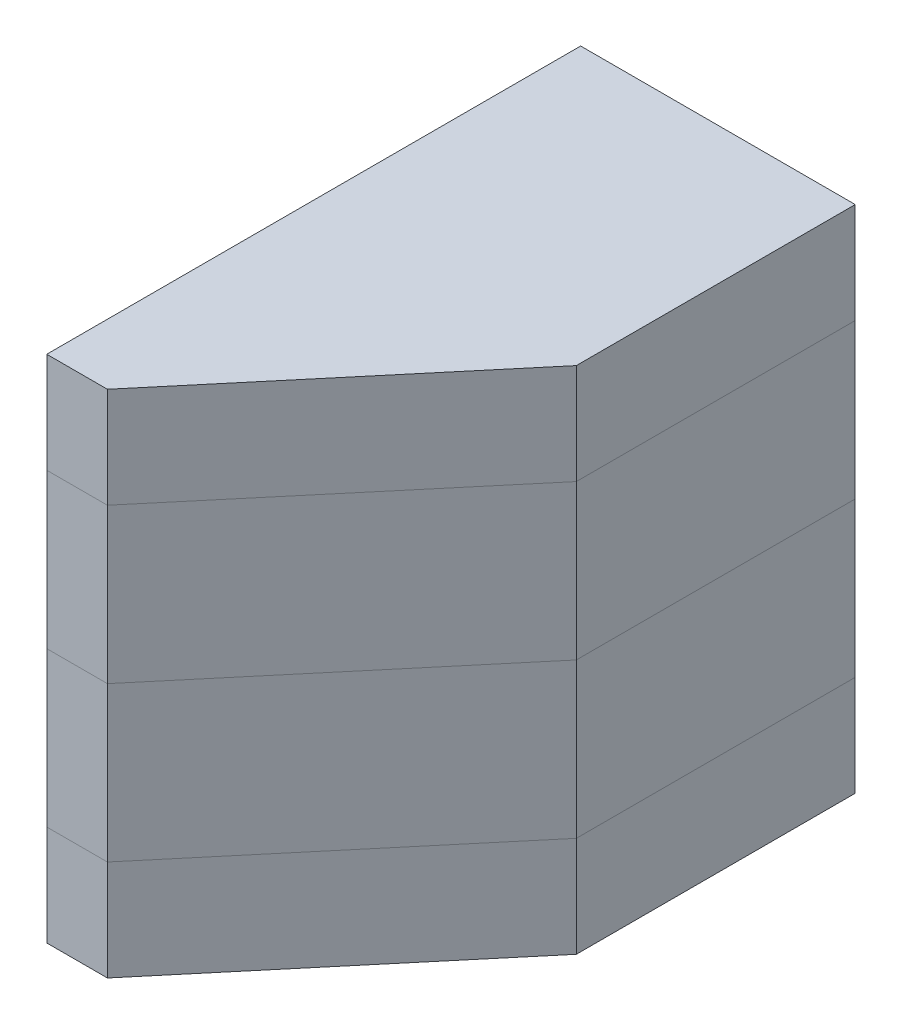
ISO-10303-21;
HEADER;
FILE_DESCRIPTION(('STEP AP214'),'2;1');
FILE_NAME('part.step','',(''),(''),'','','');
FILE_SCHEMA(('AUTOMOTIVE_DESIGN { 1 0 10303 214 1 1 1 1 }'));
ENDSEC;
DATA;
#1=APPLICATION_CONTEXT('core data for automotive mechanical design processes');
#2=APPLICATION_PROTOCOL_DEFINITION('international standard','automotive_design',2000,#1);
#3=PRODUCT_CONTEXT('',#1,'mechanical');
#4=PRODUCT('Part','Part','',(#3));
#5=PRODUCT_RELATED_PRODUCT_CATEGORY('part','',(#4));
#6=PRODUCT_DEFINITION_FORMATION('','',#4);
#7=PRODUCT_DEFINITION_CONTEXT('part definition',#1,'design');
#8=PRODUCT_DEFINITION('design','',#6,#7);
#9=PRODUCT_DEFINITION_SHAPE('','',#8);
#10=(LENGTH_UNIT() NAMED_UNIT(*) SI_UNIT(.MILLI.,.METRE.));
#11=(NAMED_UNIT(*) PLANE_ANGLE_UNIT() SI_UNIT($,.RADIAN.));
#12=(NAMED_UNIT(*) SI_UNIT($,.STERADIAN.) SOLID_ANGLE_UNIT());
#13=UNCERTAINTY_MEASURE_WITH_UNIT(LENGTH_MEASURE(1.E-05),#10,'distance_accuracy_value','');
#14=(GEOMETRIC_REPRESENTATION_CONTEXT(3) GLOBAL_UNCERTAINTY_ASSIGNED_CONTEXT((#13)) GLOBAL_UNIT_ASSIGNED_CONTEXT((#10,
#11,#12)) REPRESENTATION_CONTEXT('',''));
#15=CARTESIAN_POINT('',(0.,0.,0.));
#16=DIRECTION('',(0.,0.,1.));
#17=DIRECTION('',(1.,0.,0.));
#18=AXIS2_PLACEMENT_3D('',#15,#16,#17);
#19=CARTESIAN_POINT('',(0.,0.,0.));
#20=DIRECTION('',(0.,1.,0.));
#21=DIRECTION('',(0.,0.,-1.));
#22=AXIS2_PLACEMENT_3D('',#19,#20,#21);
#23=PLANE('',#22);
#24=DIRECTION('',(0.,0.,1.));
#25=VECTOR('',#24,1.);
#26=CARTESIAN_POINT('',(-25.,0.,50.8));
#27=LINE('',#26,#25);
#28=CARTESIAN_POINT('',(-25.,0.,-0.566132075471792));
#29=VERTEX_POINT('',#28);
#30=CARTESIAN_POINT('',(-25.,0.,50.8));
#31=VERTEX_POINT('',#30);
#32=EDGE_CURVE('E55',#29,#31,#27,.T.);
#33=ORIENTED_EDGE('',*,*,#32,.F.);
#34=DIRECTION('',(-0.952215316531976,0.,0.30542755435931));
#35=VECTOR('',#34,1.);
#36=CARTESIAN_POINT('',(0.,0.,-8.58500000000001));
#37=LINE('',#36,#35);
#38=CARTESIAN_POINT('',(0.,0.,-8.58500000000001));
#39=VERTEX_POINT('',#38);
#40=EDGE_CURVE('E153',#29,#39,#37,.F.);
#41=ORIENTED_EDGE('',*,*,#40,.T.);
#42=DIRECTION('',(0.,0.,1.));
#43=VECTOR('',#42,1.);
#44=CARTESIAN_POINT('',(0.,0.,0.));
#45=LINE('',#44,#43);
#46=CARTESIAN_POINT('',(0.,0.,-22.5));
#47=VERTEX_POINT('',#46);
#48=EDGE_CURVE('E12',#47,#39,#45,.T.);
#49=ORIENTED_EDGE('',*,*,#48,.F.);
#50=DIRECTION('',(1.,0.,0.));
#51=VECTOR('',#50,1.);
#52=CARTESIAN_POINT('',(0.,0.,-22.5));
#53=LINE('',#52,#51);
#54=CARTESIAN_POINT('',(12.7,0.,-22.5));
#55=VERTEX_POINT('',#54);
#56=EDGE_CURVE('E147',#47,#55,#53,.T.);
#57=ORIENTED_EDGE('',*,*,#56,.T.);
#58=DIRECTION('',(0.,0.,1.));
#59=VECTOR('',#58,1.);
#60=CARTESIAN_POINT('',(12.7,0.,50.8));
#61=LINE('',#60,#59);
#62=CARTESIAN_POINT('',(12.7,0.,15.7951145763081));
#63=VERTEX_POINT('',#62);
#64=EDGE_CURVE('E120',#55,#63,#61,.T.);
#65=ORIENTED_EDGE('',*,*,#64,.T.);
#66=DIRECTION('',(-0.642787609686535,0.,0.766044443118982));
#67=VECTOR('',#66,1.);
#68=CARTESIAN_POINT('',(12.7,0.,15.7951145763081));
#69=LINE('',#68,#67);
#70=CARTESIAN_POINT('',(-16.6725864484225,0.,50.8));
#71=VERTEX_POINT('',#70);
#72=EDGE_CURVE('E148',#63,#71,#69,.T.);
#73=ORIENTED_EDGE('',*,*,#72,.T.);
#74=DIRECTION('',(-1.,0.,0.));
#75=VECTOR('',#74,1.);
#76=CARTESIAN_POINT('',(-25.,0.,50.8));
#77=LINE('',#76,#75);
#78=EDGE_CURVE('E152',#71,#31,#77,.T.);
#79=ORIENTED_EDGE('',*,*,#78,.T.);
#80=EDGE_LOOP('',(#33,#41,#49,#57,#65,#73,#79));
#81=FACE_BOUND('',#80,.T.);
#82=ADVANCED_FACE('F52',(#81),#23,.F.);
#83=CARTESIAN_POINT('',(-25.,35.,50.8));
#84=DIRECTION('',(0.,0.,-1.));
#85=DIRECTION('',(-1.,0.,0.));
#86=AXIS2_PLACEMENT_3D('',#83,#84,#85);
#87=PLANE('',#86);
#88=DIRECTION('',(0.,1.,0.));
#89=VECTOR('',#88,1.);
#90=CARTESIAN_POINT('',(-16.6725864484225,-35.,50.8));
#91=LINE('',#90,#89);
#92=CARTESIAN_POINT('',(-16.6725864484225,21.21,50.8));
#93=VERTEX_POINT('',#92);
#94=EDGE_CURVE('E170',#71,#93,#91,.T.);
#95=ORIENTED_EDGE('',*,*,#94,.T.);
#96=DIRECTION('',(1.,0.,0.));
#97=VECTOR('',#96,1.);
#98=CARTESIAN_POINT('',(-25.,21.21,50.8));
#99=LINE('',#98,#97);
#100=CARTESIAN_POINT('',(-25.,21.21,50.8));
#101=VERTEX_POINT('',#100);
#102=EDGE_CURVE('E137',#101,#93,#99,.T.);
#103=ORIENTED_EDGE('',*,*,#102,.F.);
#104=DIRECTION('',(0.,-1.,0.));
#105=VECTOR('',#104,1.);
#106=CARTESIAN_POINT('',(-25.,35.,50.8));
#107=LINE('',#106,#105);
#108=EDGE_CURVE('E67',#101,#31,#107,.T.);
#109=ORIENTED_EDGE('',*,*,#108,.T.);
#110=ORIENTED_EDGE('',*,*,#78,.F.);
#111=EDGE_LOOP('',(#95,#103,#109,#110));
#112=FACE_BOUND('',#111,.T.);
#113=ADVANCED_FACE('F178',(#112),#87,.F.);
#114=CARTESIAN_POINT('',(0.,21.21,0.));
#115=DIRECTION('',(0.,-1.,0.));
#116=DIRECTION('',(0.,0.,1.));
#117=AXIS2_PLACEMENT_3D('',#114,#115,#116);
#118=PLANE('',#117);
#119=DIRECTION('',(0.,0.,-1.));
#120=VECTOR('',#119,1.);
#121=CARTESIAN_POINT('',(0.,21.21,0.));
#122=LINE('',#121,#120);
#123=CARTESIAN_POINT('',(0.,21.21,-8.58500000000001));
#124=VERTEX_POINT('',#123);
#125=CARTESIAN_POINT('',(0.,21.21,-22.5));
#126=VERTEX_POINT('',#125);
#127=EDGE_CURVE('E149',#124,#126,#122,.T.);
#128=ORIENTED_EDGE('',*,*,#127,.F.);
#129=DIRECTION('',(-0.952215316531976,0.,0.30542755435931));
#130=VECTOR('',#129,1.);
#131=CARTESIAN_POINT('',(0.,21.21,-8.58500000000001));
#132=LINE('',#131,#130);
#133=CARTESIAN_POINT('',(-25.,21.21,-0.566132075471791));
#134=VERTEX_POINT('',#133);
#135=EDGE_CURVE('E146',#134,#124,#132,.F.);
#136=ORIENTED_EDGE('',*,*,#135,.F.);
#137=DIRECTION('',(0.,0.,-1.));
#138=VECTOR('',#137,1.);
#139=CARTESIAN_POINT('',(-25.,21.21,50.8));
#140=LINE('',#139,#138);
#141=EDGE_CURVE('E139',#101,#134,#140,.T.);
#142=ORIENTED_EDGE('',*,*,#141,.F.);
#143=ORIENTED_EDGE('',*,*,#102,.T.);
#144=DIRECTION('',(0.642787609686535,0.,-0.766044443118982));
#145=VECTOR('',#144,1.);
#146=CARTESIAN_POINT('',(12.7,21.21,15.7951145763081));
#147=LINE('',#146,#145);
#148=CARTESIAN_POINT('',(12.7,21.21,15.7951145763081));
#149=VERTEX_POINT('',#148);
#150=EDGE_CURVE('E132',#93,#149,#147,.T.);
#151=ORIENTED_EDGE('',*,*,#150,.T.);
#152=DIRECTION('',(0.,0.,-1.));
#153=VECTOR('',#152,1.);
#154=CARTESIAN_POINT('',(12.7,21.21,50.8));
#155=LINE('',#154,#153);
#156=CARTESIAN_POINT('',(12.7,21.21,-22.5));
#157=VERTEX_POINT('',#156);
#158=EDGE_CURVE('E117',#149,#157,#155,.T.);
#159=ORIENTED_EDGE('',*,*,#158,.T.);
#160=DIRECTION('',(-1.,0.,0.));
#161=VECTOR('',#160,1.);
#162=CARTESIAN_POINT('',(0.,21.21,-22.5));
#163=LINE('',#162,#161);
#164=EDGE_CURVE('E127',#157,#126,#163,.T.);
#165=ORIENTED_EDGE('',*,*,#164,.T.);
#166=EDGE_LOOP('',(#128,#136,#142,#143,#151,#159,#165));
#167=FACE_BOUND('',#166,.T.);
#168=ADVANCED_FACE('F135',(#167),#118,.F.);
#169=CARTESIAN_POINT('',(12.7,35.,50.8));
#170=DIRECTION('',(-1.,0.,0.));
#171=DIRECTION('',(0.,0.,1.));
#172=AXIS2_PLACEMENT_3D('',#169,#170,#171);
#173=PLANE('',#172);
#174=DIRECTION('',(0.,-1.,0.));
#175=VECTOR('',#174,1.);
#176=CARTESIAN_POINT('',(12.7,-35.,-22.5));
#177=LINE('',#176,#175);
#178=EDGE_CURVE('E113',#157,#55,#177,.T.);
#179=ORIENTED_EDGE('',*,*,#178,.F.);
#180=ORIENTED_EDGE('',*,*,#158,.F.);
#181=DIRECTION('',(0.,1.,0.));
#182=VECTOR('',#181,1.);
#183=CARTESIAN_POINT('',(12.7,-35.,15.7951145763081));
#184=LINE('',#183,#182);
#185=EDGE_CURVE('E172',#63,#149,#184,.T.);
#186=ORIENTED_EDGE('',*,*,#185,.F.);
#187=ORIENTED_EDGE('',*,*,#64,.F.);
#188=EDGE_LOOP('',(#179,#180,#186,#187));
#189=FACE_BOUND('',#188,.T.);
#190=ADVANCED_FACE('F115',(#189),#173,.F.);
#191=CARTESIAN_POINT('',(0.,21.21,0.));
#192=DIRECTION('',(-1.,0.,0.));
#193=DIRECTION('',(0.,0.,1.));
#194=AXIS2_PLACEMENT_3D('',#191,#192,#193);
#195=PLANE('',#194);
#196=ORIENTED_EDGE('',*,*,#48,.T.);
#197=DIRECTION('',(0.,-1.,0.));
#198=VECTOR('',#197,1.);
#199=CARTESIAN_POINT('',(0.,21.21,-8.58500000000001));
#200=LINE('',#199,#198);
#201=EDGE_CURVE('E75',#124,#39,#200,.T.);
#202=ORIENTED_EDGE('',*,*,#201,.F.);
#203=ORIENTED_EDGE('',*,*,#127,.T.);
#204=DIRECTION('',(0.,1.,0.));
#205=VECTOR('',#204,1.);
#206=CARTESIAN_POINT('',(0.,21.21,-22.5));
#207=LINE('',#206,#205);
#208=EDGE_CURVE('E124',#47,#126,#207,.T.);
#209=ORIENTED_EDGE('',*,*,#208,.F.);
#210=EDGE_LOOP('',(#196,#202,#203,#209));
#211=FACE_BOUND('',#210,.T.);
#212=ADVANCED_FACE('F190',(#211),#195,.T.);
#213=CARTESIAN_POINT('',(0.,0.,-22.5));
#214=DIRECTION('',(0.,0.,1.));
#215=DIRECTION('',(1.,0.,0.));
#216=AXIS2_PLACEMENT_3D('',#213,#214,#215);
#217=PLANE('',#216);
#218=ORIENTED_EDGE('',*,*,#208,.T.);
#219=ORIENTED_EDGE('',*,*,#164,.F.);
#220=ORIENTED_EDGE('',*,*,#178,.T.);
#221=ORIENTED_EDGE('',*,*,#56,.F.);
#222=EDGE_LOOP('',(#218,#219,#220,#221));
#223=FACE_BOUND('',#222,.T.);
#224=ADVANCED_FACE('F128',(#223),#217,.F.);
#225=CARTESIAN_POINT('',(12.7,-35.,15.7951145763081));
#226=DIRECTION('',(-0.766044443118982,0.,-0.642787609686535));
#227=DIRECTION('',(-0.642787609686535,0.,0.766044443118982));
#228=AXIS2_PLACEMENT_3D('',#225,#226,#227);
#229=PLANE('',#228);
#230=ORIENTED_EDGE('',*,*,#185,.T.);
#231=ORIENTED_EDGE('',*,*,#150,.F.);
#232=ORIENTED_EDGE('',*,*,#94,.F.);
#233=ORIENTED_EDGE('',*,*,#72,.F.);
#234=EDGE_LOOP('',(#230,#231,#232,#233));
#235=FACE_BOUND('',#234,.T.);
#236=ADVANCED_FACE('F177',(#235),#229,.F.);
#237=CARTESIAN_POINT('',(-25.,35.,50.8));
#238=DIRECTION('',(-1.,0.,0.));
#239=DIRECTION('',(0.,0.,1.));
#240=AXIS2_PLACEMENT_3D('',#237,#238,#239);
#241=PLANE('',#240);
#242=ORIENTED_EDGE('',*,*,#32,.T.);
#243=ORIENTED_EDGE('',*,*,#108,.F.);
#244=ORIENTED_EDGE('',*,*,#141,.T.);
#245=DIRECTION('',(0.,-1.,0.));
#246=VECTOR('',#245,1.);
#247=CARTESIAN_POINT('',(-25.,35.,-0.566132075471792));
#248=LINE('',#247,#246);
#249=EDGE_CURVE('E133',#29,#134,#248,.F.);
#250=ORIENTED_EDGE('',*,*,#249,.F.);
#251=EDGE_LOOP('',(#242,#243,#244,#250));
#252=FACE_BOUND('',#251,.T.);
#253=ADVANCED_FACE('F161',(#252),#241,.T.);
#254=CARTESIAN_POINT('',(0.,21.21,-8.58500000000001));
#255=DIRECTION('',(-0.30542755435931,0.,-0.952215316531976));
#256=DIRECTION('',(0.,-1.,0.));
#257=AXIS2_PLACEMENT_3D('',#254,#255,#256);
#258=PLANE('',#257);
#259=ORIENTED_EDGE('',*,*,#249,.T.);
#260=ORIENTED_EDGE('',*,*,#135,.T.);
#261=ORIENTED_EDGE('',*,*,#201,.T.);
#262=ORIENTED_EDGE('',*,*,#40,.F.);
#263=EDGE_LOOP('',(#259,#260,#261,#262));
#264=FACE_BOUND('',#263,.T.);
#265=ADVANCED_FACE('F163',(#264),#258,.T.);
#266=CLOSED_SHELL('',(#82,#113,#168,#190,#212,#224,#236,#253,#265));
#267=MANIFOLD_SOLID_BREP('B2',#266);
#268=CARTESIAN_POINT('',(0.,21.21,0.));
#269=DIRECTION('',(0.,-1.,0.));
#270=DIRECTION('',(0.,0.,1.));
#271=AXIS2_PLACEMENT_3D('',#268,#269,#270);
#272=PLANE('',#271);
#273=DIRECTION('',(0.,0.,-1.));
#274=VECTOR('',#273,1.);
#275=CARTESIAN_POINT('',(12.7,21.21,50.8));
#276=LINE('',#275,#274);
#277=CARTESIAN_POINT('',(12.7,21.21,15.7951145763081));
#278=VERTEX_POINT('',#277);
#279=CARTESIAN_POINT('',(12.7,21.21,-22.5));
#280=VERTEX_POINT('',#279);
#281=EDGE_CURVE('E322',#278,#280,#276,.T.);
#282=ORIENTED_EDGE('',*,*,#281,.F.);
#283=DIRECTION('',(0.642787609686535,0.,-0.766044443118982));
#284=VECTOR('',#283,1.);
#285=CARTESIAN_POINT('',(12.7,21.21,15.7951145763081));
#286=LINE('',#285,#284);
#287=CARTESIAN_POINT('',(-16.6725864484225,21.21,50.8));
#288=VERTEX_POINT('',#287);
#289=EDGE_CURVE('E330',#288,#278,#286,.T.);
#290=ORIENTED_EDGE('',*,*,#289,.F.);
#291=DIRECTION('',(1.,0.,0.));
#292=VECTOR('',#291,1.);
#293=CARTESIAN_POINT('',(-25.,21.21,50.8));
#294=LINE('',#293,#292);
#295=CARTESIAN_POINT('',(-25.,21.21,50.8));
#296=VERTEX_POINT('',#295);
#297=EDGE_CURVE('E329',#296,#288,#294,.T.);
#298=ORIENTED_EDGE('',*,*,#297,.F.);
#299=DIRECTION('',(0.,0.,1.));
#300=VECTOR('',#299,1.);
#301=CARTESIAN_POINT('',(-25.,21.21,50.8));
#302=LINE('',#301,#300);
#303=CARTESIAN_POINT('',(-25.,21.21,-22.5));
#304=VERTEX_POINT('',#303);
#305=EDGE_CURVE('E324',#304,#296,#302,.T.);
#306=ORIENTED_EDGE('',*,*,#305,.F.);
#307=DIRECTION('',(-1.,0.,0.));
#308=VECTOR('',#307,1.);
#309=CARTESIAN_POINT('',(-25.,21.21,-22.5));
#310=LINE('',#309,#308);
#311=EDGE_CURVE('E275',#280,#304,#310,.T.);
#312=ORIENTED_EDGE('',*,*,#311,.F.);
#313=EDGE_LOOP('',(#282,#290,#298,#306,#312));
#314=FACE_BOUND('',#313,.T.);
#315=ADVANCED_FACE('F267',(#314),#272,.T.);
#316=CARTESIAN_POINT('',(-25.,35.,50.8));
#317=DIRECTION('',(-1.,0.,0.));
#318=DIRECTION('',(0.,0.,1.));
#319=AXIS2_PLACEMENT_3D('',#316,#317,#318);
#320=PLANE('',#319);
#321=DIRECTION('',(0.,-1.,0.));
#322=VECTOR('',#321,1.);
#323=CARTESIAN_POINT('',(-25.,35.,50.8));
#324=LINE('',#323,#322);
#325=CARTESIAN_POINT('',(-25.,35.,50.8));
#326=VERTEX_POINT('',#325);
#327=EDGE_CURVE('E333',#326,#296,#324,.T.);
#328=ORIENTED_EDGE('',*,*,#327,.F.);
#329=DIRECTION('',(0.,0.,-1.));
#330=VECTOR('',#329,1.);
#331=CARTESIAN_POINT('',(-25.,35.,50.8));
#332=LINE('',#331,#330);
#333=CARTESIAN_POINT('',(-25.,35.,-22.5));
#334=VERTEX_POINT('',#333);
#335=EDGE_CURVE('E351',#326,#334,#332,.T.);
#336=ORIENTED_EDGE('',*,*,#335,.T.);
#337=DIRECTION('',(0.,1.,0.));
#338=VECTOR('',#337,1.);
#339=CARTESIAN_POINT('',(-25.,35.,-22.5));
#340=LINE('',#339,#338);
#341=EDGE_CURVE('E282',#304,#334,#340,.T.);
#342=ORIENTED_EDGE('',*,*,#341,.F.);
#343=ORIENTED_EDGE('',*,*,#305,.T.);
#344=EDGE_LOOP('',(#328,#336,#342,#343));
#345=FACE_BOUND('',#344,.T.);
#346=ADVANCED_FACE('F352',(#345),#320,.T.);
#347=CARTESIAN_POINT('',(0.,35.,0.));
#348=DIRECTION('',(0.,-1.,0.));
#349=DIRECTION('',(0.,0.,-1.));
#350=AXIS2_PLACEMENT_3D('',#347,#348,#349);
#351=PLANE('',#350);
#352=DIRECTION('',(0.,0.,-1.));
#353=VECTOR('',#352,1.);
#354=CARTESIAN_POINT('',(12.7,35.,50.8));
#355=LINE('',#354,#353);
#356=CARTESIAN_POINT('',(12.7,35.,15.7951145763081));
#357=VERTEX_POINT('',#356);
#358=CARTESIAN_POINT('',(12.7,35.,-22.5));
#359=VERTEX_POINT('',#358);
#360=EDGE_CURVE('E353',#357,#359,#355,.T.);
#361=ORIENTED_EDGE('',*,*,#360,.T.);
#362=DIRECTION('',(1.,0.,0.));
#363=VECTOR('',#362,1.);
#364=CARTESIAN_POINT('',(12.7,35.,-22.5));
#365=LINE('',#364,#363);
#366=EDGE_CURVE('E290',#334,#359,#365,.T.);
#367=ORIENTED_EDGE('',*,*,#366,.F.);
#368=ORIENTED_EDGE('',*,*,#335,.F.);
#369=DIRECTION('',(1.,0.,0.));
#370=VECTOR('',#369,1.);
#371=CARTESIAN_POINT('',(-25.,35.,50.8));
#372=LINE('',#371,#370);
#373=CARTESIAN_POINT('',(-16.6725864484225,35.,50.8));
#374=VERTEX_POINT('',#373);
#375=EDGE_CURVE('E338',#326,#374,#372,.T.);
#376=ORIENTED_EDGE('',*,*,#375,.T.);
#377=DIRECTION('',(-0.642787609686535,0.,0.766044443118982));
#378=VECTOR('',#377,1.);
#379=CARTESIAN_POINT('',(12.7,35.,15.7951145763081));
#380=LINE('',#379,#378);
#381=EDGE_CURVE('E340',#357,#374,#380,.T.);
#382=ORIENTED_EDGE('',*,*,#381,.F.);
#383=EDGE_LOOP('',(#361,#367,#368,#376,#382));
#384=FACE_BOUND('',#383,.T.);
#385=ADVANCED_FACE('F356',(#384),#351,.F.);
#386=CARTESIAN_POINT('',(12.7,35.,50.8));
#387=DIRECTION('',(-1.,0.,0.));
#388=DIRECTION('',(0.,0.,1.));
#389=AXIS2_PLACEMENT_3D('',#386,#387,#388);
#390=PLANE('',#389);
#391=ORIENTED_EDGE('',*,*,#281,.T.);
#392=DIRECTION('',(0.,-1.,0.));
#393=VECTOR('',#392,1.);
#394=CARTESIAN_POINT('',(12.7,-35.,-22.5));
#395=LINE('',#394,#393);
#396=EDGE_CURVE('E50',#359,#280,#395,.T.);
#397=ORIENTED_EDGE('',*,*,#396,.F.);
#398=ORIENTED_EDGE('',*,*,#360,.F.);
#399=DIRECTION('',(0.,1.,0.));
#400=VECTOR('',#399,1.);
#401=CARTESIAN_POINT('',(12.7,-35.,15.7951145763081));
#402=LINE('',#401,#400);
#403=EDGE_CURVE('E327',#278,#357,#402,.T.);
#404=ORIENTED_EDGE('',*,*,#403,.F.);
#405=EDGE_LOOP('',(#391,#397,#398,#404));
#406=FACE_BOUND('',#405,.T.);
#407=ADVANCED_FACE('F326',(#406),#390,.F.);
#408=CARTESIAN_POINT('',(0.,0.,-22.5));
#409=DIRECTION('',(0.,0.,1.));
#410=DIRECTION('',(1.,0.,0.));
#411=AXIS2_PLACEMENT_3D('',#408,#409,#410);
#412=PLANE('',#411);
#413=ORIENTED_EDGE('',*,*,#311,.T.);
#414=ORIENTED_EDGE('',*,*,#341,.T.);
#415=ORIENTED_EDGE('',*,*,#366,.T.);
#416=ORIENTED_EDGE('',*,*,#396,.T.);
#417=EDGE_LOOP('',(#413,#414,#415,#416));
#418=FACE_BOUND('',#417,.T.);
#419=ADVANCED_FACE('F269',(#418),#412,.F.);
#420=CARTESIAN_POINT('',(-25.,35.,50.8));
#421=DIRECTION('',(0.,0.,-1.));
#422=DIRECTION('',(-1.,0.,0.));
#423=AXIS2_PLACEMENT_3D('',#420,#421,#422);
#424=PLANE('',#423);
#425=ORIENTED_EDGE('',*,*,#297,.T.);
#426=DIRECTION('',(0.,1.,0.));
#427=VECTOR('',#426,1.);
#428=CARTESIAN_POINT('',(-16.6725864484225,-35.,50.8));
#429=LINE('',#428,#427);
#430=EDGE_CURVE('E339',#288,#374,#429,.T.);
#431=ORIENTED_EDGE('',*,*,#430,.T.);
#432=ORIENTED_EDGE('',*,*,#375,.F.);
#433=ORIENTED_EDGE('',*,*,#327,.T.);
#434=EDGE_LOOP('',(#425,#431,#432,#433));
#435=FACE_BOUND('',#434,.T.);
#436=ADVANCED_FACE('F358',(#435),#424,.F.);
#437=CARTESIAN_POINT('',(12.7,-35.,15.7951145763081));
#438=DIRECTION('',(-0.766044443118982,0.,-0.642787609686535));
#439=DIRECTION('',(-0.642787609686535,0.,0.766044443118982));
#440=AXIS2_PLACEMENT_3D('',#437,#438,#439);
#441=PLANE('',#440);
#442=ORIENTED_EDGE('',*,*,#289,.T.);
#443=ORIENTED_EDGE('',*,*,#403,.T.);
#444=ORIENTED_EDGE('',*,*,#381,.T.);
#445=ORIENTED_EDGE('',*,*,#430,.F.);
#446=EDGE_LOOP('',(#442,#443,#444,#445));
#447=FACE_BOUND('',#446,.T.);
#448=ADVANCED_FACE('F359',(#447),#441,.F.);
#449=CLOSED_SHELL('',(#315,#346,#385,#407,#419,#436,#448));
#450=MANIFOLD_SOLID_BREP('B6',#449);
#451=CARTESIAN_POINT('',(0.,-21.21,0.));
#452=DIRECTION('',(0.,1.,0.));
#453=DIRECTION('',(0.,0.,-1.));
#454=AXIS2_PLACEMENT_3D('',#451,#452,#453);
#455=PLANE('',#454);
#456=DIRECTION('',(1.,0.,0.));
#457=VECTOR('',#456,1.);
#458=CARTESIAN_POINT('',(0.,-21.21,-22.5));
#459=LINE('',#458,#457);
#460=CARTESIAN_POINT('',(-25.,-21.21,-22.5));
#461=VERTEX_POINT('',#460);
#462=CARTESIAN_POINT('',(12.7,-21.21,-22.5));
#463=VERTEX_POINT('',#462);
#464=EDGE_CURVE('E495',#461,#463,#459,.T.);
#465=ORIENTED_EDGE('',*,*,#464,.F.);
#466=DIRECTION('',(0.,0.,1.));
#467=VECTOR('',#466,1.);
#468=CARTESIAN_POINT('',(-25.,-21.21,50.8));
#469=LINE('',#468,#467);
#470=CARTESIAN_POINT('',(-25.,-21.21,50.8));
#471=VERTEX_POINT('',#470);
#472=EDGE_CURVE('E506',#461,#471,#469,.T.);
#473=ORIENTED_EDGE('',*,*,#472,.T.);
#474=DIRECTION('',(-1.,0.,0.));
#475=VECTOR('',#474,1.);
#476=CARTESIAN_POINT('',(-25.,-21.21,50.8));
#477=LINE('',#476,#475);
#478=CARTESIAN_POINT('',(-16.6725864484225,-21.21,50.8));
#479=VERTEX_POINT('',#478);
#480=EDGE_CURVE('E490',#479,#471,#477,.T.);
#481=ORIENTED_EDGE('',*,*,#480,.F.);
#482=DIRECTION('',(-0.642787609686535,0.,0.766044443118982));
#483=VECTOR('',#482,1.);
#484=CARTESIAN_POINT('',(12.7,-21.21,15.7951145763081));
#485=LINE('',#484,#483);
#486=CARTESIAN_POINT('',(12.7,-21.21,15.7951145763081));
#487=VERTEX_POINT('',#486);
#488=EDGE_CURVE('E498',#487,#479,#485,.T.);
#489=ORIENTED_EDGE('',*,*,#488,.F.);
#490=DIRECTION('',(0.,0.,1.));
#491=VECTOR('',#490,1.);
#492=CARTESIAN_POINT('',(12.7,-21.21,50.8));
#493=LINE('',#492,#491);
#494=EDGE_CURVE('E486',#463,#487,#493,.T.);
#495=ORIENTED_EDGE('',*,*,#494,.F.);
#496=EDGE_LOOP('',(#465,#473,#481,#489,#495));
#497=FACE_BOUND('',#496,.T.);
#498=ADVANCED_FACE('F432',(#497),#455,.T.);
#499=CARTESIAN_POINT('',(-25.,35.,50.8));
#500=DIRECTION('',(0.,0.,-1.));
#501=DIRECTION('',(-1.,0.,0.));
#502=AXIS2_PLACEMENT_3D('',#499,#500,#501);
#503=PLANE('',#502);
#504=ORIENTED_EDGE('',*,*,#480,.T.);
#505=DIRECTION('',(0.,-1.,0.));
#506=VECTOR('',#505,1.);
#507=CARTESIAN_POINT('',(-25.,35.,50.8));
#508=LINE('',#507,#506);
#509=CARTESIAN_POINT('',(-25.,-35.,50.8));
#510=VERTEX_POINT('',#509);
#511=EDGE_CURVE('E265',#471,#510,#508,.T.);
#512=ORIENTED_EDGE('',*,*,#511,.T.);
#513=DIRECTION('',(1.,0.,0.));
#514=VECTOR('',#513,1.);
#515=CARTESIAN_POINT('',(-25.,-35.,50.8));
#516=LINE('',#515,#514);
#517=CARTESIAN_POINT('',(-16.6725864484225,-35.,50.8));
#518=VERTEX_POINT('',#517);
#519=EDGE_CURVE('E440',#510,#518,#516,.T.);
#520=ORIENTED_EDGE('',*,*,#519,.T.);
#521=DIRECTION('',(0.,1.,0.));
#522=VECTOR('',#521,1.);
#523=CARTESIAN_POINT('',(-16.6725864484225,-35.,50.8));
#524=LINE('',#523,#522);
#525=EDGE_CURVE('E509',#518,#479,#524,.T.);
#526=ORIENTED_EDGE('',*,*,#525,.T.);
#527=EDGE_LOOP('',(#504,#512,#520,#526));
#528=FACE_BOUND('',#527,.T.);
#529=ADVANCED_FACE('F519',(#528),#503,.F.);
#530=CARTESIAN_POINT('',(12.7,35.,50.8));
#531=DIRECTION('',(-1.,0.,0.));
#532=DIRECTION('',(0.,0.,1.));
#533=AXIS2_PLACEMENT_3D('',#530,#531,#532);
#534=PLANE('',#533);
#535=ORIENTED_EDGE('',*,*,#494,.T.);
#536=DIRECTION('',(0.,1.,0.));
#537=VECTOR('',#536,1.);
#538=CARTESIAN_POINT('',(12.7,-35.,15.7951145763081));
#539=LINE('',#538,#537);
#540=CARTESIAN_POINT('',(12.7,-35.,15.7951145763081));
#541=VERTEX_POINT('',#540);
#542=EDGE_CURVE('E501',#541,#487,#539,.T.);
#543=ORIENTED_EDGE('',*,*,#542,.F.);
#544=DIRECTION('',(0.,0.,-1.));
#545=VECTOR('',#544,1.);
#546=CARTESIAN_POINT('',(12.7,-35.,50.8));
#547=LINE('',#546,#545);
#548=CARTESIAN_POINT('',(12.7,-35.,-22.5));
#549=VERTEX_POINT('',#548);
#550=EDGE_CURVE('E488',#541,#549,#547,.T.);
#551=ORIENTED_EDGE('',*,*,#550,.T.);
#552=DIRECTION('',(0.,-1.,0.));
#553=VECTOR('',#552,1.);
#554=CARTESIAN_POINT('',(12.7,-35.,-22.5));
#555=LINE('',#554,#553);
#556=EDGE_CURVE('E482',#463,#549,#555,.T.);
#557=ORIENTED_EDGE('',*,*,#556,.F.);
#558=EDGE_LOOP('',(#535,#543,#551,#557));
#559=FACE_BOUND('',#558,.T.);
#560=ADVANCED_FACE('F484',(#559),#534,.F.);
#561=CARTESIAN_POINT('',(0.,-35.,0.));
#562=DIRECTION('',(0.,-1.,0.));
#563=DIRECTION('',(0.,0.,-1.));
#564=AXIS2_PLACEMENT_3D('',#561,#562,#563);
#565=PLANE('',#564);
#566=DIRECTION('',(-1.,0.,0.));
#567=VECTOR('',#566,1.);
#568=CARTESIAN_POINT('',(-25.,-35.,-22.5));
#569=LINE('',#568,#567);
#570=CARTESIAN_POINT('',(-25.,-35.,-22.5));
#571=VERTEX_POINT('',#570);
#572=EDGE_CURVE('E489',#549,#571,#569,.T.);
#573=ORIENTED_EDGE('',*,*,#572,.F.);
#574=ORIENTED_EDGE('',*,*,#550,.F.);
#575=DIRECTION('',(-0.642787609686535,0.,0.766044443118982));
#576=VECTOR('',#575,1.);
#577=CARTESIAN_POINT('',(12.7,-35.,15.7951145763081));
#578=LINE('',#577,#576);
#579=EDGE_CURVE('E455',#541,#518,#578,.T.);
#580=ORIENTED_EDGE('',*,*,#579,.T.);
#581=ORIENTED_EDGE('',*,*,#519,.F.);
#582=DIRECTION('',(0.,0.,-1.));
#583=VECTOR('',#582,1.);
#584=CARTESIAN_POINT('',(-25.,-35.,50.8));
#585=LINE('',#584,#583);
#586=EDGE_CURVE('E508',#510,#571,#585,.T.);
#587=ORIENTED_EDGE('',*,*,#586,.T.);
#588=EDGE_LOOP('',(#573,#574,#580,#581,#587));
#589=FACE_BOUND('',#588,.T.);
#590=ADVANCED_FACE('F524',(#589),#565,.T.);
#591=CARTESIAN_POINT('',(-25.,35.,50.8));
#592=DIRECTION('',(-1.,0.,0.));
#593=DIRECTION('',(0.,0.,1.));
#594=AXIS2_PLACEMENT_3D('',#591,#592,#593);
#595=PLANE('',#594);
#596=ORIENTED_EDGE('',*,*,#472,.F.);
#597=DIRECTION('',(0.,1.,0.));
#598=VECTOR('',#597,1.);
#599=CARTESIAN_POINT('',(-25.,-21.21,-22.5));
#600=LINE('',#599,#598);
#601=EDGE_CURVE('E447',#571,#461,#600,.T.);
#602=ORIENTED_EDGE('',*,*,#601,.F.);
#603=ORIENTED_EDGE('',*,*,#586,.F.);
#604=ORIENTED_EDGE('',*,*,#511,.F.);
#605=EDGE_LOOP('',(#596,#602,#603,#604));
#606=FACE_BOUND('',#605,.T.);
#607=ADVANCED_FACE('F523',(#606),#595,.T.);
#608=CARTESIAN_POINT('',(0.,0.,-22.5));
#609=DIRECTION('',(0.,0.,1.));
#610=DIRECTION('',(1.,0.,0.));
#611=AXIS2_PLACEMENT_3D('',#608,#609,#610);
#612=PLANE('',#611);
#613=ORIENTED_EDGE('',*,*,#556,.T.);
#614=ORIENTED_EDGE('',*,*,#572,.T.);
#615=ORIENTED_EDGE('',*,*,#601,.T.);
#616=ORIENTED_EDGE('',*,*,#464,.T.);
#617=EDGE_LOOP('',(#613,#614,#615,#616));
#618=FACE_BOUND('',#617,.T.);
#619=ADVANCED_FACE('F434',(#618),#612,.F.);
#620=CARTESIAN_POINT('',(12.7,-35.,15.7951145763081));
#621=DIRECTION('',(-0.766044443118982,0.,-0.642787609686535));
#622=DIRECTION('',(-0.642787609686535,0.,0.766044443118982));
#623=AXIS2_PLACEMENT_3D('',#620,#621,#622);
#624=PLANE('',#623);
#625=ORIENTED_EDGE('',*,*,#488,.T.);
#626=ORIENTED_EDGE('',*,*,#525,.F.);
#627=ORIENTED_EDGE('',*,*,#579,.F.);
#628=ORIENTED_EDGE('',*,*,#542,.T.);
#629=EDGE_LOOP('',(#625,#626,#627,#628));
#630=FACE_BOUND('',#629,.T.);
#631=ADVANCED_FACE('F521',(#630),#624,.F.);
#632=CLOSED_SHELL('',(#498,#529,#560,#590,#607,#619,#631));
#633=MANIFOLD_SOLID_BREP('B44',#632);
#634=CARTESIAN_POINT('',(0.,-21.21,0.));
#635=DIRECTION('',(0.,1.,0.));
#636=DIRECTION('',(0.,0.,-1.));
#637=AXIS2_PLACEMENT_3D('',#634,#635,#636);
#638=PLANE('',#637);
#639=DIRECTION('',(-0.642787609686535,0.,0.766044443118982));
#640=VECTOR('',#639,1.);
#641=CARTESIAN_POINT('',(12.7,-21.21,15.7951145763081));
#642=LINE('',#641,#640);
#643=CARTESIAN_POINT('',(12.7,-21.21,15.7951145763081));
#644=VERTEX_POINT('',#643);
#645=CARTESIAN_POINT('',(-16.6725864484225,-21.21,50.8));
#646=VERTEX_POINT('',#645);
#647=EDGE_CURVE('E699',#644,#646,#642,.T.);
#648=ORIENTED_EDGE('',*,*,#647,.T.);
#649=DIRECTION('',(-1.,0.,0.));
#650=VECTOR('',#649,1.);
#651=CARTESIAN_POINT('',(-25.,-21.21,50.8));
#652=LINE('',#651,#650);
#653=CARTESIAN_POINT('',(-25.,-21.21,50.8));
#654=VERTEX_POINT('',#653);
#655=EDGE_CURVE('E594',#646,#654,#652,.T.);
#656=ORIENTED_EDGE('',*,*,#655,.T.);
#657=DIRECTION('',(0.,0.,1.));
#658=VECTOR('',#657,1.);
#659=CARTESIAN_POINT('',(-25.,-21.21,50.8));
#660=LINE('',#659,#658);
#661=CARTESIAN_POINT('',(-25.,-21.21,-0.566132075471792));
#662=VERTEX_POINT('',#661);
#663=EDGE_CURVE('E599',#662,#654,#660,.T.);
#664=ORIENTED_EDGE('',*,*,#663,.F.);
#665=DIRECTION('',(0.952215316531976,0.,-0.30542755435931));
#666=VECTOR('',#665,1.);
#667=CARTESIAN_POINT('',(-207.631776952873,-21.21,58.0138718528077));
#668=LINE('',#667,#666);
#669=CARTESIAN_POINT('',(0.,-21.21,-8.58500000000001));
#670=VERTEX_POINT('',#669);
#671=EDGE_CURVE('E430',#670,#662,#668,.F.);
#672=ORIENTED_EDGE('',*,*,#671,.F.);
#673=DIRECTION('',(0.,0.,-1.));
#674=VECTOR('',#673,1.);
#675=CARTESIAN_POINT('',(0.,-21.21,0.));
#676=LINE('',#675,#674);
#677=CARTESIAN_POINT('',(0.,-21.21,-22.5));
#678=VERTEX_POINT('',#677);
#679=EDGE_CURVE('E692',#670,#678,#676,.T.);
#680=ORIENTED_EDGE('',*,*,#679,.T.);
#681=DIRECTION('',(1.,0.,0.));
#682=VECTOR('',#681,1.);
#683=CARTESIAN_POINT('',(0.,-21.21,-22.5));
#684=LINE('',#683,#682);
#685=CARTESIAN_POINT('',(12.7,-21.21,-22.5));
#686=VERTEX_POINT('',#685);
#687=EDGE_CURVE('E662',#678,#686,#684,.T.);
#688=ORIENTED_EDGE('',*,*,#687,.T.);
#689=DIRECTION('',(0.,0.,1.));
#690=VECTOR('',#689,1.);
#691=CARTESIAN_POINT('',(12.7,-21.21,50.8));
#692=LINE('',#691,#690);
#693=EDGE_CURVE('E658',#686,#644,#692,.T.);
#694=ORIENTED_EDGE('',*,*,#693,.T.);
#695=EDGE_LOOP('',(#648,#656,#664,#672,#680,#688,#694));
#696=FACE_BOUND('',#695,.T.);
#697=ADVANCED_FACE('F591',(#696),#638,.F.);
#698=CARTESIAN_POINT('',(0.,0.,0.));
#699=DIRECTION('',(0.,1.,0.));
#700=DIRECTION('',(0.,0.,-1.));
#701=AXIS2_PLACEMENT_3D('',#698,#699,#700);
#702=PLANE('',#701);
#703=DIRECTION('',(0.,0.,1.));
#704=VECTOR('',#703,1.);
#705=CARTESIAN_POINT('',(-25.,0.,50.8));
#706=LINE('',#705,#704);
#707=CARTESIAN_POINT('',(-25.,0.,-0.566132075471792));
#708=VERTEX_POINT('',#707);
#709=CARTESIAN_POINT('',(-25.,0.,50.8));
#710=VERTEX_POINT('',#709);
#711=EDGE_CURVE('E681',#708,#710,#706,.T.);
#712=ORIENTED_EDGE('',*,*,#711,.T.);
#713=DIRECTION('',(-1.,0.,0.));
#714=VECTOR('',#713,1.);
#715=CARTESIAN_POINT('',(-25.,0.,50.8));
#716=LINE('',#715,#714);
#717=CARTESIAN_POINT('',(-16.6725864484225,0.,50.8));
#718=VERTEX_POINT('',#717);
#719=EDGE_CURVE('E677',#718,#710,#716,.T.);
#720=ORIENTED_EDGE('',*,*,#719,.F.);
#721=DIRECTION('',(-0.642787609686535,0.,0.766044443118982));
#722=VECTOR('',#721,1.);
#723=CARTESIAN_POINT('',(12.7,0.,15.7951145763081));
#724=LINE('',#723,#722);
#725=CARTESIAN_POINT('',(12.7,0.,15.7951145763081));
#726=VERTEX_POINT('',#725);
#727=EDGE_CURVE('E671',#726,#718,#724,.T.);
#728=ORIENTED_EDGE('',*,*,#727,.F.);
#729=DIRECTION('',(0.,0.,1.));
#730=VECTOR('',#729,1.);
#731=CARTESIAN_POINT('',(12.7,0.,50.8));
#732=LINE('',#731,#730);
#733=CARTESIAN_POINT('',(12.7,0.,-22.5));
#734=VERTEX_POINT('',#733);
#735=EDGE_CURVE('E655',#734,#726,#732,.T.);
#736=ORIENTED_EDGE('',*,*,#735,.F.);
#737=DIRECTION('',(1.,0.,0.));
#738=VECTOR('',#737,1.);
#739=CARTESIAN_POINT('',(0.,0.,-22.5));
#740=LINE('',#739,#738);
#741=CARTESIAN_POINT('',(0.,0.,-22.5));
#742=VERTEX_POINT('',#741);
#743=EDGE_CURVE('E666',#742,#734,#740,.T.);
#744=ORIENTED_EDGE('',*,*,#743,.F.);
#745=DIRECTION('',(0.,0.,1.));
#746=VECTOR('',#745,1.);
#747=CARTESIAN_POINT('',(0.,0.,0.));
#748=LINE('',#747,#746);
#749=CARTESIAN_POINT('',(0.,0.,-8.58500000000001));
#750=VERTEX_POINT('',#749);
#751=EDGE_CURVE('E689',#742,#750,#748,.T.);
#752=ORIENTED_EDGE('',*,*,#751,.T.);
#753=DIRECTION('',(-0.952215316531976,0.,0.30542755435931));
#754=VECTOR('',#753,1.);
#755=CARTESIAN_POINT('',(0.,0.,-8.58500000000001));
#756=LINE('',#755,#754);
#757=EDGE_CURVE('E678',#708,#750,#756,.F.);
#758=ORIENTED_EDGE('',*,*,#757,.F.);
#759=EDGE_LOOP('',(#712,#720,#728,#736,#744,#752,#758));
#760=FACE_BOUND('',#759,.T.);
#761=ADVANCED_FACE('F674',(#760),#702,.T.);
#762=CARTESIAN_POINT('',(-25.,35.,50.8));
#763=DIRECTION('',(-1.,0.,0.));
#764=DIRECTION('',(0.,0.,1.));
#765=AXIS2_PLACEMENT_3D('',#762,#763,#764);
#766=PLANE('',#765);
#767=ORIENTED_EDGE('',*,*,#663,.T.);
#768=DIRECTION('',(0.,-1.,0.));
#769=VECTOR('',#768,1.);
#770=CARTESIAN_POINT('',(-25.,35.,50.8));
#771=LINE('',#770,#769);
#772=EDGE_CURVE('E688',#710,#654,#771,.T.);
#773=ORIENTED_EDGE('',*,*,#772,.F.);
#774=ORIENTED_EDGE('',*,*,#711,.F.);
#775=DIRECTION('',(0.,-1.,0.));
#776=VECTOR('',#775,1.);
#777=CARTESIAN_POINT('',(-25.,35.,-0.566132075471792));
#778=LINE('',#777,#776);
#779=EDGE_CURVE('E607',#662,#708,#778,.F.);
#780=ORIENTED_EDGE('',*,*,#779,.F.);
#781=EDGE_LOOP('',(#767,#773,#774,#780));
#782=FACE_BOUND('',#781,.T.);
#783=ADVANCED_FACE('F711',(#782),#766,.T.);
#784=CARTESIAN_POINT('',(-25.,35.,50.8));
#785=DIRECTION('',(0.,0.,-1.));
#786=DIRECTION('',(-1.,0.,0.));
#787=AXIS2_PLACEMENT_3D('',#784,#785,#786);
#788=PLANE('',#787);
#789=DIRECTION('',(0.,1.,0.));
#790=VECTOR('',#789,1.);
#791=CARTESIAN_POINT('',(-16.6725864484225,-35.,50.8));
#792=LINE('',#791,#790);
#793=EDGE_CURVE('E693',#646,#718,#792,.T.);
#794=ORIENTED_EDGE('',*,*,#793,.T.);
#795=ORIENTED_EDGE('',*,*,#719,.T.);
#796=ORIENTED_EDGE('',*,*,#772,.T.);
#797=ORIENTED_EDGE('',*,*,#655,.F.);
#798=EDGE_LOOP('',(#794,#795,#796,#797));
#799=FACE_BOUND('',#798,.T.);
#800=ADVANCED_FACE('F710',(#799),#788,.F.);
#801=CARTESIAN_POINT('',(12.7,35.,50.8));
#802=DIRECTION('',(-1.,0.,0.));
#803=DIRECTION('',(0.,0.,1.));
#804=AXIS2_PLACEMENT_3D('',#801,#802,#803);
#805=PLANE('',#804);
#806=DIRECTION('',(0.,-1.,0.));
#807=VECTOR('',#806,1.);
#808=CARTESIAN_POINT('',(12.7,-35.,-22.5));
#809=LINE('',#808,#807);
#810=EDGE_CURVE('E651',#734,#686,#809,.T.);
#811=ORIENTED_EDGE('',*,*,#810,.F.);
#812=ORIENTED_EDGE('',*,*,#735,.T.);
#813=DIRECTION('',(0.,1.,0.));
#814=VECTOR('',#813,1.);
#815=CARTESIAN_POINT('',(12.7,-35.,15.7951145763081));
#816=LINE('',#815,#814);
#817=EDGE_CURVE('E695',#644,#726,#816,.T.);
#818=ORIENTED_EDGE('',*,*,#817,.F.);
#819=ORIENTED_EDGE('',*,*,#693,.F.);
#820=EDGE_LOOP('',(#811,#812,#818,#819));
#821=FACE_BOUND('',#820,.T.);
#822=ADVANCED_FACE('F653',(#821),#805,.F.);
#823=CARTESIAN_POINT('',(0.,21.21,0.));
#824=DIRECTION('',(-1.,0.,0.));
#825=DIRECTION('',(0.,0.,1.));
#826=AXIS2_PLACEMENT_3D('',#823,#824,#825);
#827=PLANE('',#826);
#828=DIRECTION('',(0.,1.,0.));
#829=VECTOR('',#828,1.);
#830=CARTESIAN_POINT('',(0.,21.21,-22.5));
#831=LINE('',#830,#829);
#832=EDGE_CURVE('E663',#678,#742,#831,.T.);
#833=ORIENTED_EDGE('',*,*,#832,.F.);
#834=ORIENTED_EDGE('',*,*,#679,.F.);
#835=DIRECTION('',(0.,-1.,0.));
#836=VECTOR('',#835,1.);
#837=CARTESIAN_POINT('',(0.,21.21,-8.58500000000001));
#838=LINE('',#837,#836);
#839=EDGE_CURVE('E613',#750,#670,#838,.T.);
#840=ORIENTED_EDGE('',*,*,#839,.F.);
#841=ORIENTED_EDGE('',*,*,#751,.F.);
#842=EDGE_LOOP('',(#833,#834,#840,#841));
#843=FACE_BOUND('',#842,.T.);
#844=ADVANCED_FACE('F719',(#843),#827,.T.);
#845=CARTESIAN_POINT('',(0.,21.21,-8.58500000000001));
#846=DIRECTION('',(-0.30542755435931,0.,-0.952215316531976));
#847=DIRECTION('',(0.,-1.,0.));
#848=AXIS2_PLACEMENT_3D('',#845,#846,#847);
#849=PLANE('',#848);
#850=ORIENTED_EDGE('',*,*,#757,.T.);
#851=ORIENTED_EDGE('',*,*,#839,.T.);
#852=ORIENTED_EDGE('',*,*,#671,.T.);
#853=ORIENTED_EDGE('',*,*,#779,.T.);
#854=EDGE_LOOP('',(#850,#851,#852,#853));
#855=FACE_BOUND('',#854,.T.);
#856=ADVANCED_FACE('F714',(#855),#849,.T.);
#857=CARTESIAN_POINT('',(12.7,-35.,15.7951145763081));
#858=DIRECTION('',(-0.766044443118982,0.,-0.642787609686535));
#859=DIRECTION('',(-0.642787609686535,0.,0.766044443118982));
#860=AXIS2_PLACEMENT_3D('',#857,#858,#859);
#861=PLANE('',#860);
#862=ORIENTED_EDGE('',*,*,#817,.T.);
#863=ORIENTED_EDGE('',*,*,#727,.T.);
#864=ORIENTED_EDGE('',*,*,#793,.F.);
#865=ORIENTED_EDGE('',*,*,#647,.F.);
#866=EDGE_LOOP('',(#862,#863,#864,#865));
#867=FACE_BOUND('',#866,.T.);
#868=ADVANCED_FACE('F708',(#867),#861,.F.);
#869=CARTESIAN_POINT('',(0.,0.,-22.5));
#870=DIRECTION('',(0.,0.,1.));
#871=DIRECTION('',(1.,0.,0.));
#872=AXIS2_PLACEMENT_3D('',#869,#870,#871);
#873=PLANE('',#872);
#874=ORIENTED_EDGE('',*,*,#832,.T.);
#875=ORIENTED_EDGE('',*,*,#743,.T.);
#876=ORIENTED_EDGE('',*,*,#810,.T.);
#877=ORIENTED_EDGE('',*,*,#687,.F.);
#878=EDGE_LOOP('',(#874,#875,#876,#877));
#879=FACE_BOUND('',#878,.T.);
#880=ADVANCED_FACE('F667',(#879),#873,.F.);
#881=CLOSED_SHELL('',(#697,#761,#783,#800,#822,#844,#856,#868,#880));
#882=MANIFOLD_SOLID_BREP('B259',#881);
#883=ADVANCED_BREP_SHAPE_REPRESENTATION('',(#18,#267,#450,#633,#882),#14);
#884=SHAPE_DEFINITION_REPRESENTATION(#9,#883);
ENDSEC;
END-ISO-10303-21;
